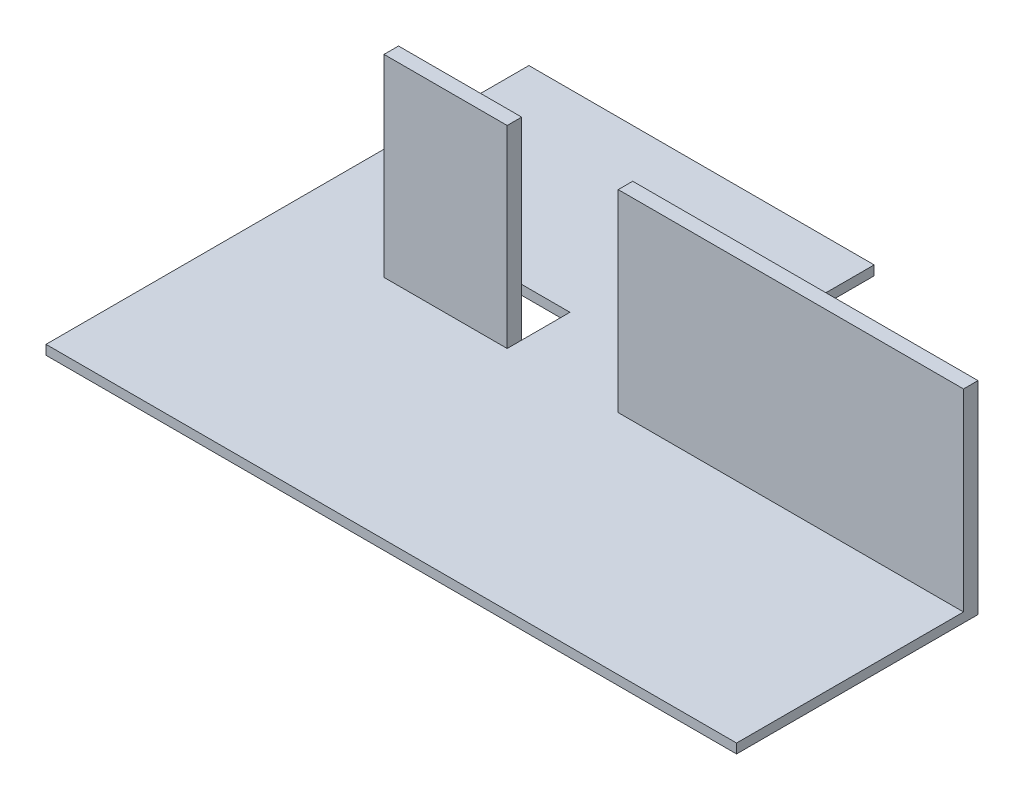
ISO-10303-21;
HEADER;
FILE_DESCRIPTION(('STEP AP214'),'2;1');
FILE_NAME('part.step','',(''),(''),'','','');
FILE_SCHEMA(('AUTOMOTIVE_DESIGN { 1 0 10303 214 1 1 1 1 }'));
ENDSEC;
DATA;
#1=APPLICATION_CONTEXT('core data for automotive mechanical design processes');
#2=APPLICATION_PROTOCOL_DEFINITION('international standard','automotive_design',2000,#1);
#3=PRODUCT_CONTEXT('',#1,'mechanical');
#4=PRODUCT('Part','Part','',(#3));
#5=PRODUCT_RELATED_PRODUCT_CATEGORY('part','',(#4));
#6=PRODUCT_DEFINITION_FORMATION('','',#4);
#7=PRODUCT_DEFINITION_CONTEXT('part definition',#1,'design');
#8=PRODUCT_DEFINITION('design','',#6,#7);
#9=PRODUCT_DEFINITION_SHAPE('','',#8);
#10=(LENGTH_UNIT() NAMED_UNIT(*) SI_UNIT(.MILLI.,.METRE.));
#11=(NAMED_UNIT(*) PLANE_ANGLE_UNIT() SI_UNIT($,.RADIAN.));
#12=(NAMED_UNIT(*) SI_UNIT($,.STERADIAN.) SOLID_ANGLE_UNIT());
#13=UNCERTAINTY_MEASURE_WITH_UNIT(LENGTH_MEASURE(1.E-05),#10,'distance_accuracy_value','');
#14=(GEOMETRIC_REPRESENTATION_CONTEXT(3) GLOBAL_UNCERTAINTY_ASSIGNED_CONTEXT((#13)) GLOBAL_UNIT_ASSIGNED_CONTEXT((#10,
#11,#12)) REPRESENTATION_CONTEXT('',''));
#15=CARTESIAN_POINT('',(0.,0.,0.));
#16=DIRECTION('',(0.,0.,1.));
#17=DIRECTION('',(1.,0.,0.));
#18=AXIS2_PLACEMENT_3D('',#15,#16,#17);
#19=CARTESIAN_POINT('',(-18.161,0.5,-12.7));
#20=DIRECTION('',(0.,-1.,0.));
#21=DIRECTION('',(0.,0.,-1.));
#22=AXIS2_PLACEMENT_3D('',#19,#20,#21);
#23=PLANE('',#22);
#24=DIRECTION('',(0.,0.,-1.));
#25=VECTOR('',#24,1.);
#26=CARTESIAN_POINT('',(-5.842,0.5,0.));
#27=LINE('',#26,#25);
#28=CARTESIAN_POINT('',(-5.842,0.5,0.762));
#29=VERTEX_POINT('',#28);
#30=CARTESIAN_POINT('',(-5.842,0.5,0.));
#31=VERTEX_POINT('',#30);
#32=EDGE_CURVE('E164',#29,#31,#27,.T.);
#33=ORIENTED_EDGE('',*,*,#32,.F.);
#34=DIRECTION('',(1.,0.,0.));
#35=VECTOR('',#34,1.);
#36=CARTESIAN_POINT('',(-5.842,0.5,0.762));
#37=LINE('',#36,#35);
#38=CARTESIAN_POINT('',(-12.319,0.5,0.762000000000001));
#39=VERTEX_POINT('',#38);
#40=EDGE_CURVE('E177',#39,#29,#37,.T.);
#41=ORIENTED_EDGE('',*,*,#40,.F.);
#42=DIRECTION('',(0.,0.,1.));
#43=VECTOR('',#42,1.);
#44=CARTESIAN_POINT('',(-12.319,0.5,0.));
#45=LINE('',#44,#43);
#46=CARTESIAN_POINT('',(-12.319,0.5,0.));
#47=VERTEX_POINT('',#46);
#48=EDGE_CURVE('E167',#47,#39,#45,.T.);
#49=ORIENTED_EDGE('',*,*,#48,.F.);
#50=DIRECTION('',(0.,0.,1.));
#51=VECTOR('',#50,1.);
#52=CARTESIAN_POINT('',(-12.319,0.5,0.));
#53=LINE('',#52,#51);
#54=CARTESIAN_POINT('',(-12.319,0.5,-2.54));
#55=VERTEX_POINT('',#54);
#56=EDGE_CURVE('E205',#55,#47,#53,.T.);
#57=ORIENTED_EDGE('',*,*,#56,.F.);
#58=DIRECTION('',(-1.,0.,0.));
#59=VECTOR('',#58,1.);
#60=CARTESIAN_POINT('',(-12.319,0.5,-2.54));
#61=LINE('',#60,#59);
#62=CARTESIAN_POINT('',(-5.842,0.5,-2.54));
#63=VERTEX_POINT('',#62);
#64=EDGE_CURVE('E202',#63,#55,#61,.T.);
#65=ORIENTED_EDGE('',*,*,#64,.F.);
#66=DIRECTION('',(0.,0.,-1.));
#67=VECTOR('',#66,1.);
#68=CARTESIAN_POINT('',(-5.842,0.5,0.));
#69=LINE('',#68,#67);
#70=EDGE_CURVE('E200',#31,#63,#69,.T.);
#71=ORIENTED_EDGE('',*,*,#70,.F.);
#72=EDGE_LOOP('',(#33,#41,#49,#57,#65,#71));
#73=FACE_BOUND('',#72,.T.);
#74=DIRECTION('',(0.,0.,1.));
#75=VECTOR('',#74,1.);
#76=CARTESIAN_POINT('',(0.,0.5,0.));
#77=LINE('',#76,#75);
#78=CARTESIAN_POINT('',(0.,0.5,0.));
#79=VERTEX_POINT('',#78);
#80=CARTESIAN_POINT('',(0.,0.5,0.762000000000007));
#81=VERTEX_POINT('',#80);
#82=EDGE_CURVE('E163',#79,#81,#77,.T.);
#83=ORIENTED_EDGE('',*,*,#82,.F.);
#84=DIRECTION('',(0.,0.,-1.));
#85=VECTOR('',#84,1.);
#86=CARTESIAN_POINT('',(0.,0.5,-12.7));
#87=LINE('',#86,#85);
#88=CARTESIAN_POINT('',(0.,0.5,-12.7));
#89=VERTEX_POINT('',#88);
#90=EDGE_CURVE('E236',#79,#89,#87,.T.);
#91=ORIENTED_EDGE('',*,*,#90,.T.);
#92=DIRECTION('',(-1.,0.,0.));
#93=VECTOR('',#92,1.);
#94=CARTESIAN_POINT('',(-18.161,0.5,-12.7));
#95=LINE('',#94,#93);
#96=CARTESIAN_POINT('',(-18.161,0.5,-12.7));
#97=VERTEX_POINT('',#96);
#98=EDGE_CURVE('E238',#89,#97,#95,.T.);
#99=ORIENTED_EDGE('',*,*,#98,.T.);
#100=DIRECTION('',(0.,0.,1.));
#101=VECTOR('',#100,1.);
#102=CARTESIAN_POINT('',(-18.161,0.5,12.7));
#103=LINE('',#102,#101);
#104=CARTESIAN_POINT('',(-18.161,0.5,12.7));
#105=VERTEX_POINT('',#104);
#106=EDGE_CURVE('E229',#97,#105,#103,.T.);
#107=ORIENTED_EDGE('',*,*,#106,.T.);
#108=DIRECTION('',(1.,0.,0.));
#109=VECTOR('',#108,1.);
#110=CARTESIAN_POINT('',(-18.161,0.5,12.7));
#111=LINE('',#110,#109);
#112=CARTESIAN_POINT('',(18.161,0.5,12.7));
#113=VERTEX_POINT('',#112);
#114=EDGE_CURVE('E232',#105,#113,#111,.T.);
#115=ORIENTED_EDGE('',*,*,#114,.T.);
#116=DIRECTION('',(0.,0.,-1.));
#117=VECTOR('',#116,1.);
#118=CARTESIAN_POINT('',(18.161,0.5,12.7));
#119=LINE('',#118,#117);
#120=CARTESIAN_POINT('',(18.161,0.5,0.762000000000007));
#121=VERTEX_POINT('',#120);
#122=EDGE_CURVE('E52',#113,#121,#119,.T.);
#123=ORIENTED_EDGE('',*,*,#122,.T.);
#124=DIRECTION('',(1.,0.,0.));
#125=VECTOR('',#124,1.);
#126=CARTESIAN_POINT('',(0.,0.5,0.762000000000007));
#127=LINE('',#126,#125);
#128=EDGE_CURVE('E47',#81,#121,#127,.T.);
#129=ORIENTED_EDGE('',*,*,#128,.F.);
#130=EDGE_LOOP('',(#83,#91,#99,#107,#115,#123,#129));
#131=FACE_BOUND('',#130,.T.);
#132=ADVANCED_FACE('F32',(#73,#131),#23,.F.);
#133=CARTESIAN_POINT('',(-18.161,0.,-12.7));
#134=DIRECTION('',(0.,-1.,0.));
#135=DIRECTION('',(0.,0.,-1.));
#136=AXIS2_PLACEMENT_3D('',#133,#134,#135);
#137=PLANE('',#136);
#138=DIRECTION('',(0.,0.,1.));
#139=VECTOR('',#138,1.);
#140=CARTESIAN_POINT('',(-18.161,0.,12.7));
#141=LINE('',#140,#139);
#142=CARTESIAN_POINT('',(-18.161,0.,-12.7));
#143=VERTEX_POINT('',#142);
#144=CARTESIAN_POINT('',(-18.161,0.,12.7));
#145=VERTEX_POINT('',#144);
#146=EDGE_CURVE('E228',#143,#145,#141,.T.);
#147=ORIENTED_EDGE('',*,*,#146,.F.);
#148=DIRECTION('',(-1.,0.,0.));
#149=VECTOR('',#148,1.);
#150=CARTESIAN_POINT('',(-18.161,0.,-12.7));
#151=LINE('',#150,#149);
#152=CARTESIAN_POINT('',(0.,0.,-12.7));
#153=VERTEX_POINT('',#152);
#154=EDGE_CURVE('E233',#153,#143,#151,.T.);
#155=ORIENTED_EDGE('',*,*,#154,.F.);
#156=DIRECTION('',(0.,0.,-1.));
#157=VECTOR('',#156,1.);
#158=CARTESIAN_POINT('',(0.,0.,-12.7));
#159=LINE('',#158,#157);
#160=CARTESIAN_POINT('',(0.,0.,0.));
#161=VERTEX_POINT('',#160);
#162=EDGE_CURVE('E249',#161,#153,#159,.T.);
#163=ORIENTED_EDGE('',*,*,#162,.F.);
#164=DIRECTION('',(-1.,0.,0.));
#165=VECTOR('',#164,1.);
#166=CARTESIAN_POINT('',(18.161,0.,0.));
#167=LINE('',#166,#165);
#168=CARTESIAN_POINT('',(18.161,0.,0.));
#169=VERTEX_POINT('',#168);
#170=EDGE_CURVE('E247',#169,#161,#167,.T.);
#171=ORIENTED_EDGE('',*,*,#170,.F.);
#172=DIRECTION('',(0.,0.,-1.));
#173=VECTOR('',#172,1.);
#174=CARTESIAN_POINT('',(18.161,0.,12.7));
#175=LINE('',#174,#173);
#176=CARTESIAN_POINT('',(18.161,0.,12.7));
#177=VERTEX_POINT('',#176);
#178=EDGE_CURVE('E245',#177,#169,#175,.T.);
#179=ORIENTED_EDGE('',*,*,#178,.F.);
#180=DIRECTION('',(1.,0.,0.));
#181=VECTOR('',#180,1.);
#182=CARTESIAN_POINT('',(-18.161,0.,12.7));
#183=LINE('',#182,#181);
#184=EDGE_CURVE('E243',#145,#177,#183,.T.);
#185=ORIENTED_EDGE('',*,*,#184,.F.);
#186=EDGE_LOOP('',(#147,#155,#163,#171,#179,#185));
#187=FACE_BOUND('',#186,.T.);
#188=DIRECTION('',(1.,0.,0.));
#189=VECTOR('',#188,1.);
#190=CARTESIAN_POINT('',(-12.319,0.,0.));
#191=LINE('',#190,#189);
#192=CARTESIAN_POINT('',(-12.319,0.,0.));
#193=VERTEX_POINT('',#192);
#194=CARTESIAN_POINT('',(-5.842,0.,0.));
#195=VERTEX_POINT('',#194);
#196=EDGE_CURVE('E203',#193,#195,#191,.T.);
#197=ORIENTED_EDGE('',*,*,#196,.T.);
#198=DIRECTION('',(0.,0.,-1.));
#199=VECTOR('',#198,1.);
#200=CARTESIAN_POINT('',(-5.842,0.,0.));
#201=LINE('',#200,#199);
#202=CARTESIAN_POINT('',(-5.842,0.,-2.54));
#203=VERTEX_POINT('',#202);
#204=EDGE_CURVE('E199',#195,#203,#201,.T.);
#205=ORIENTED_EDGE('',*,*,#204,.T.);
#206=DIRECTION('',(-1.,0.,0.));
#207=VECTOR('',#206,1.);
#208=CARTESIAN_POINT('',(-12.319,0.,-2.54));
#209=LINE('',#208,#207);
#210=CARTESIAN_POINT('',(-12.319,0.,-2.54));
#211=VERTEX_POINT('',#210);
#212=EDGE_CURVE('E211',#203,#211,#209,.T.);
#213=ORIENTED_EDGE('',*,*,#212,.T.);
#214=DIRECTION('',(0.,0.,1.));
#215=VECTOR('',#214,1.);
#216=CARTESIAN_POINT('',(-12.319,0.,0.));
#217=LINE('',#216,#215);
#218=EDGE_CURVE('E214',#211,#193,#217,.T.);
#219=ORIENTED_EDGE('',*,*,#218,.T.);
#220=EDGE_LOOP('',(#197,#205,#213,#219));
#221=FACE_BOUND('',#220,.T.);
#222=ADVANCED_FACE('F271',(#187,#221),#137,.T.);
#223=CARTESIAN_POINT('',(-18.161,0.5,12.7));
#224=DIRECTION('',(1.,0.,0.));
#225=DIRECTION('',(0.,0.,-1.));
#226=AXIS2_PLACEMENT_3D('',#223,#224,#225);
#227=PLANE('',#226);
#228=ORIENTED_EDGE('',*,*,#146,.T.);
#229=DIRECTION('',(0.,-1.,0.));
#230=VECTOR('',#229,1.);
#231=CARTESIAN_POINT('',(-18.161,0.5,12.7));
#232=LINE('',#231,#230);
#233=EDGE_CURVE('E11',#105,#145,#232,.T.);
#234=ORIENTED_EDGE('',*,*,#233,.F.);
#235=ORIENTED_EDGE('',*,*,#106,.F.);
#236=DIRECTION('',(0.,-1.,0.));
#237=VECTOR('',#236,1.);
#238=CARTESIAN_POINT('',(-18.161,0.5,-12.7));
#239=LINE('',#238,#237);
#240=EDGE_CURVE('E240',#97,#143,#239,.T.);
#241=ORIENTED_EDGE('',*,*,#240,.T.);
#242=EDGE_LOOP('',(#228,#234,#235,#241));
#243=FACE_BOUND('',#242,.T.);
#244=ADVANCED_FACE('F34',(#243),#227,.F.);
#245=CARTESIAN_POINT('',(-18.161,0.5,12.7));
#246=DIRECTION('',(0.,0.,-1.));
#247=DIRECTION('',(-1.,0.,0.));
#248=AXIS2_PLACEMENT_3D('',#245,#246,#247);
#249=PLANE('',#248);
#250=ORIENTED_EDGE('',*,*,#184,.T.);
#251=DIRECTION('',(0.,-1.,0.));
#252=VECTOR('',#251,1.);
#253=CARTESIAN_POINT('',(18.161,0.5,12.7));
#254=LINE('',#253,#252);
#255=EDGE_CURVE('E40',#113,#177,#254,.T.);
#256=ORIENTED_EDGE('',*,*,#255,.F.);
#257=ORIENTED_EDGE('',*,*,#114,.F.);
#258=ORIENTED_EDGE('',*,*,#233,.T.);
#259=EDGE_LOOP('',(#250,#256,#257,#258));
#260=FACE_BOUND('',#259,.T.);
#261=ADVANCED_FACE('F292',(#260),#249,.F.);
#262=CARTESIAN_POINT('',(18.161,0.5,12.7));
#263=DIRECTION('',(-1.,0.,0.));
#264=DIRECTION('',(0.,0.,1.));
#265=AXIS2_PLACEMENT_3D('',#262,#263,#264);
#266=PLANE('',#265);
#267=ORIENTED_EDGE('',*,*,#178,.T.);
#268=DIRECTION('',(0.,-1.,0.));
#269=VECTOR('',#268,1.);
#270=CARTESIAN_POINT('',(18.161,0.5,0.));
#271=LINE('',#270,#269);
#272=CARTESIAN_POINT('',(18.161,10.66,0.));
#273=VERTEX_POINT('',#272);
#274=EDGE_CURVE('E260',#273,#169,#271,.T.);
#275=ORIENTED_EDGE('',*,*,#274,.F.);
#276=DIRECTION('',(0.,0.,-1.));
#277=VECTOR('',#276,1.);
#278=CARTESIAN_POINT('',(18.161,10.66,0.));
#279=LINE('',#278,#277);
#280=CARTESIAN_POINT('',(18.161,10.66,0.762000000000007));
#281=VERTEX_POINT('',#280);
#282=EDGE_CURVE('E151',#281,#273,#279,.T.);
#283=ORIENTED_EDGE('',*,*,#282,.F.);
#284=DIRECTION('',(0.,-1.,0.));
#285=VECTOR('',#284,1.);
#286=CARTESIAN_POINT('',(18.161,10.66,0.762000000000007));
#287=LINE('',#286,#285);
#288=EDGE_CURVE('E147',#281,#121,#287,.T.);
#289=ORIENTED_EDGE('',*,*,#288,.T.);
#290=ORIENTED_EDGE('',*,*,#122,.F.);
#291=ORIENTED_EDGE('',*,*,#255,.T.);
#292=EDGE_LOOP('',(#267,#275,#283,#289,#290,#291));
#293=FACE_BOUND('',#292,.T.);
#294=ADVANCED_FACE('F266',(#293),#266,.F.);
#295=CARTESIAN_POINT('',(18.161,0.5,0.));
#296=DIRECTION('',(0.,0.,1.));
#297=DIRECTION('',(1.,0.,0.));
#298=AXIS2_PLACEMENT_3D('',#295,#296,#297);
#299=PLANE('',#298);
#300=ORIENTED_EDGE('',*,*,#170,.T.);
#301=DIRECTION('',(0.,-1.,0.));
#302=VECTOR('',#301,1.);
#303=CARTESIAN_POINT('',(0.,0.5,0.));
#304=LINE('',#303,#302);
#305=EDGE_CURVE('E257',#79,#161,#304,.T.);
#306=ORIENTED_EDGE('',*,*,#305,.F.);
#307=DIRECTION('',(0.,-1.,0.));
#308=VECTOR('',#307,1.);
#309=CARTESIAN_POINT('',(0.,10.66,0.));
#310=LINE('',#309,#308);
#311=CARTESIAN_POINT('',(0.,10.66,0.));
#312=VERTEX_POINT('',#311);
#313=EDGE_CURVE('E169',#312,#79,#310,.T.);
#314=ORIENTED_EDGE('',*,*,#313,.F.);
#315=DIRECTION('',(-1.,0.,0.));
#316=VECTOR('',#315,1.);
#317=CARTESIAN_POINT('',(0.,10.66,0.));
#318=LINE('',#317,#316);
#319=EDGE_CURVE('E157',#273,#312,#318,.T.);
#320=ORIENTED_EDGE('',*,*,#319,.F.);
#321=ORIENTED_EDGE('',*,*,#274,.T.);
#322=EDGE_LOOP('',(#300,#306,#314,#320,#321));
#323=FACE_BOUND('',#322,.T.);
#324=ADVANCED_FACE('F277',(#323),#299,.F.);
#325=CARTESIAN_POINT('',(0.,0.5,-12.7));
#326=DIRECTION('',(-1.,0.,0.));
#327=DIRECTION('',(0.,0.,1.));
#328=AXIS2_PLACEMENT_3D('',#325,#326,#327);
#329=PLANE('',#328);
#330=ORIENTED_EDGE('',*,*,#162,.T.);
#331=DIRECTION('',(0.,-1.,0.));
#332=VECTOR('',#331,1.);
#333=CARTESIAN_POINT('',(0.,0.5,-12.7));
#334=LINE('',#333,#332);
#335=EDGE_CURVE('E254',#89,#153,#334,.T.);
#336=ORIENTED_EDGE('',*,*,#335,.F.);
#337=ORIENTED_EDGE('',*,*,#90,.F.);
#338=ORIENTED_EDGE('',*,*,#305,.T.);
#339=EDGE_LOOP('',(#330,#336,#337,#338));
#340=FACE_BOUND('',#339,.T.);
#341=ADVANCED_FACE('F279',(#340),#329,.F.);
#342=CARTESIAN_POINT('',(-18.161,0.5,-12.7));
#343=DIRECTION('',(0.,0.,1.));
#344=DIRECTION('',(1.,0.,0.));
#345=AXIS2_PLACEMENT_3D('',#342,#343,#344);
#346=PLANE('',#345);
#347=ORIENTED_EDGE('',*,*,#154,.T.);
#348=ORIENTED_EDGE('',*,*,#240,.F.);
#349=ORIENTED_EDGE('',*,*,#98,.F.);
#350=ORIENTED_EDGE('',*,*,#335,.T.);
#351=EDGE_LOOP('',(#347,#348,#349,#350));
#352=FACE_BOUND('',#351,.T.);
#353=ADVANCED_FACE('F290',(#352),#346,.F.);
#354=CARTESIAN_POINT('',(-5.842,0.5,0.));
#355=DIRECTION('',(-1.,0.,0.));
#356=DIRECTION('',(0.,0.,1.));
#357=AXIS2_PLACEMENT_3D('',#354,#355,#356);
#358=PLANE('',#357);
#359=ORIENTED_EDGE('',*,*,#204,.F.);
#360=DIRECTION('',(0.,-1.,0.));
#361=VECTOR('',#360,1.);
#362=CARTESIAN_POINT('',(-5.842,0.5,0.));
#363=LINE('',#362,#361);
#364=EDGE_CURVE('E208',#31,#195,#363,.T.);
#365=ORIENTED_EDGE('',*,*,#364,.F.);
#366=ORIENTED_EDGE('',*,*,#70,.T.);
#367=DIRECTION('',(0.,-1.,0.));
#368=VECTOR('',#367,1.);
#369=CARTESIAN_POINT('',(-5.842,0.5,-2.54));
#370=LINE('',#369,#368);
#371=EDGE_CURVE('E225',#63,#203,#370,.T.);
#372=ORIENTED_EDGE('',*,*,#371,.T.);
#373=EDGE_LOOP('',(#359,#365,#366,#372));
#374=FACE_BOUND('',#373,.T.);
#375=ADVANCED_FACE('F307',(#374),#358,.T.);
#376=CARTESIAN_POINT('',(-12.319,0.5,-2.54));
#377=DIRECTION('',(0.,0.,1.));
#378=DIRECTION('',(1.,0.,0.));
#379=AXIS2_PLACEMENT_3D('',#376,#377,#378);
#380=PLANE('',#379);
#381=ORIENTED_EDGE('',*,*,#212,.F.);
#382=ORIENTED_EDGE('',*,*,#371,.F.);
#383=ORIENTED_EDGE('',*,*,#64,.T.);
#384=DIRECTION('',(0.,-1.,0.));
#385=VECTOR('',#384,1.);
#386=CARTESIAN_POINT('',(-12.319,0.5,-2.54));
#387=LINE('',#386,#385);
#388=EDGE_CURVE('E223',#55,#211,#387,.T.);
#389=ORIENTED_EDGE('',*,*,#388,.T.);
#390=EDGE_LOOP('',(#381,#382,#383,#389));
#391=FACE_BOUND('',#390,.T.);
#392=ADVANCED_FACE('F334',(#391),#380,.T.);
#393=CARTESIAN_POINT('',(-12.319,0.5,0.));
#394=DIRECTION('',(1.,0.,0.));
#395=DIRECTION('',(0.,0.,-1.));
#396=AXIS2_PLACEMENT_3D('',#393,#394,#395);
#397=PLANE('',#396);
#398=ORIENTED_EDGE('',*,*,#218,.F.);
#399=ORIENTED_EDGE('',*,*,#388,.F.);
#400=ORIENTED_EDGE('',*,*,#56,.T.);
#401=DIRECTION('',(0.,-1.,0.));
#402=VECTOR('',#401,1.);
#403=CARTESIAN_POINT('',(-12.319,0.5,0.));
#404=LINE('',#403,#402);
#405=EDGE_CURVE('E221',#47,#193,#404,.T.);
#406=ORIENTED_EDGE('',*,*,#405,.T.);
#407=EDGE_LOOP('',(#398,#399,#400,#406));
#408=FACE_BOUND('',#407,.T.);
#409=ADVANCED_FACE('F341',(#408),#397,.T.);
#410=CARTESIAN_POINT('',(-12.319,0.5,0.));
#411=DIRECTION('',(0.,0.,-1.));
#412=DIRECTION('',(-1.,0.,0.));
#413=AXIS2_PLACEMENT_3D('',#410,#411,#412);
#414=PLANE('',#413);
#415=ORIENTED_EDGE('',*,*,#196,.F.);
#416=ORIENTED_EDGE('',*,*,#405,.F.);
#417=DIRECTION('',(0.,-1.,0.));
#418=VECTOR('',#417,1.);
#419=CARTESIAN_POINT('',(-12.319,10.66,0.));
#420=LINE('',#419,#418);
#421=CARTESIAN_POINT('',(-12.319,10.66,0.));
#422=VERTEX_POINT('',#421);
#423=EDGE_CURVE('E193',#422,#47,#420,.T.);
#424=ORIENTED_EDGE('',*,*,#423,.F.);
#425=DIRECTION('',(-1.,0.,0.));
#426=VECTOR('',#425,1.);
#427=CARTESIAN_POINT('',(-5.842,10.66,0.));
#428=LINE('',#427,#426);
#429=CARTESIAN_POINT('',(-5.842,10.66,0.));
#430=VERTEX_POINT('',#429);
#431=EDGE_CURVE('E176',#430,#422,#428,.T.);
#432=ORIENTED_EDGE('',*,*,#431,.F.);
#433=DIRECTION('',(0.,-1.,0.));
#434=VECTOR('',#433,1.);
#435=CARTESIAN_POINT('',(-5.842,10.66,0.));
#436=LINE('',#435,#434);
#437=EDGE_CURVE('E196',#430,#31,#436,.T.);
#438=ORIENTED_EDGE('',*,*,#437,.T.);
#439=ORIENTED_EDGE('',*,*,#364,.T.);
#440=EDGE_LOOP('',(#415,#416,#424,#432,#438,#439));
#441=FACE_BOUND('',#440,.T.);
#442=ADVANCED_FACE('F347',(#441),#414,.T.);
#443=CARTESIAN_POINT('',(-5.842,10.66,0.));
#444=DIRECTION('',(-1.,0.,0.));
#445=DIRECTION('',(0.,0.,1.));
#446=AXIS2_PLACEMENT_3D('',#443,#444,#445);
#447=PLANE('',#446);
#448=ORIENTED_EDGE('',*,*,#32,.T.);
#449=ORIENTED_EDGE('',*,*,#437,.F.);
#450=DIRECTION('',(0.,0.,-1.));
#451=VECTOR('',#450,1.);
#452=CARTESIAN_POINT('',(-5.842,10.66,0.));
#453=LINE('',#452,#451);
#454=CARTESIAN_POINT('',(-5.842,10.66,0.762));
#455=VERTEX_POINT('',#454);
#456=EDGE_CURVE('E173',#455,#430,#453,.T.);
#457=ORIENTED_EDGE('',*,*,#456,.F.);
#458=DIRECTION('',(0.,-1.,0.));
#459=VECTOR('',#458,1.);
#460=CARTESIAN_POINT('',(-5.842,10.66,0.762));
#461=LINE('',#460,#459);
#462=EDGE_CURVE('E182',#455,#29,#461,.T.);
#463=ORIENTED_EDGE('',*,*,#462,.T.);
#464=EDGE_LOOP('',(#448,#449,#457,#463));
#465=FACE_BOUND('',#464,.T.);
#466=ADVANCED_FACE('F355',(#465),#447,.F.);
#467=CARTESIAN_POINT('',(-12.319,10.66,0.));
#468=DIRECTION('',(1.,0.,0.));
#469=DIRECTION('',(0.,0.,-1.));
#470=AXIS2_PLACEMENT_3D('',#467,#468,#469);
#471=PLANE('',#470);
#472=ORIENTED_EDGE('',*,*,#48,.T.);
#473=DIRECTION('',(0.,-1.,0.));
#474=VECTOR('',#473,1.);
#475=CARTESIAN_POINT('',(-12.319,10.66,0.762000000000001));
#476=LINE('',#475,#474);
#477=CARTESIAN_POINT('',(-12.319,10.66,0.762000000000001));
#478=VERTEX_POINT('',#477);
#479=EDGE_CURVE('E190',#478,#39,#476,.T.);
#480=ORIENTED_EDGE('',*,*,#479,.F.);
#481=DIRECTION('',(0.,0.,1.));
#482=VECTOR('',#481,1.);
#483=CARTESIAN_POINT('',(-12.319,10.66,0.));
#484=LINE('',#483,#482);
#485=EDGE_CURVE('E179',#422,#478,#484,.T.);
#486=ORIENTED_EDGE('',*,*,#485,.F.);
#487=ORIENTED_EDGE('',*,*,#423,.T.);
#488=EDGE_LOOP('',(#472,#480,#486,#487));
#489=FACE_BOUND('',#488,.T.);
#490=ADVANCED_FACE('F363',(#489),#471,.F.);
#491=CARTESIAN_POINT('',(-5.842,10.66,0.762));
#492=DIRECTION('',(0.,0.,-1.));
#493=DIRECTION('',(-1.,0.,0.));
#494=AXIS2_PLACEMENT_3D('',#491,#492,#493);
#495=PLANE('',#494);
#496=ORIENTED_EDGE('',*,*,#40,.T.);
#497=ORIENTED_EDGE('',*,*,#462,.F.);
#498=DIRECTION('',(1.,0.,0.));
#499=VECTOR('',#498,1.);
#500=CARTESIAN_POINT('',(-5.842,10.66,0.762));
#501=LINE('',#500,#499);
#502=EDGE_CURVE('E181',#478,#455,#501,.T.);
#503=ORIENTED_EDGE('',*,*,#502,.F.);
#504=ORIENTED_EDGE('',*,*,#479,.T.);
#505=EDGE_LOOP('',(#496,#497,#503,#504));
#506=FACE_BOUND('',#505,.T.);
#507=ADVANCED_FACE('F371',(#506),#495,.F.);
#508=CARTESIAN_POINT('',(-5.842,10.66,0.762));
#509=DIRECTION('',(0.,-1.,0.));
#510=DIRECTION('',(0.,0.,-1.));
#511=AXIS2_PLACEMENT_3D('',#508,#509,#510);
#512=PLANE('',#511);
#513=ORIENTED_EDGE('',*,*,#456,.T.);
#514=ORIENTED_EDGE('',*,*,#431,.T.);
#515=ORIENTED_EDGE('',*,*,#485,.T.);
#516=ORIENTED_EDGE('',*,*,#502,.T.);
#517=EDGE_LOOP('',(#513,#514,#515,#516));
#518=FACE_BOUND('',#517,.T.);
#519=ADVANCED_FACE('F379',(#518),#512,.F.);
#520=CARTESIAN_POINT('',(0.,10.66,0.));
#521=DIRECTION('',(1.,0.,0.));
#522=DIRECTION('',(0.,0.,-1.));
#523=AXIS2_PLACEMENT_3D('',#520,#521,#522);
#524=PLANE('',#523);
#525=ORIENTED_EDGE('',*,*,#82,.T.);
#526=DIRECTION('',(0.,-1.,0.));
#527=VECTOR('',#526,1.);
#528=CARTESIAN_POINT('',(0.,10.66,0.762000000000007));
#529=LINE('',#528,#527);
#530=CARTESIAN_POINT('',(0.,10.66,0.762000000000007));
#531=VERTEX_POINT('',#530);
#532=EDGE_CURVE('E144',#531,#81,#529,.T.);
#533=ORIENTED_EDGE('',*,*,#532,.F.);
#534=DIRECTION('',(0.,0.,1.));
#535=VECTOR('',#534,1.);
#536=CARTESIAN_POINT('',(0.,10.66,0.));
#537=LINE('',#536,#535);
#538=EDGE_CURVE('E152',#312,#531,#537,.T.);
#539=ORIENTED_EDGE('',*,*,#538,.F.);
#540=ORIENTED_EDGE('',*,*,#313,.T.);
#541=EDGE_LOOP('',(#525,#533,#539,#540));
#542=FACE_BOUND('',#541,.T.);
#543=ADVANCED_FACE('F162',(#542),#524,.F.);
#544=CARTESIAN_POINT('',(0.,10.66,0.762000000000007));
#545=DIRECTION('',(0.,0.,-1.));
#546=DIRECTION('',(-1.,0.,0.));
#547=AXIS2_PLACEMENT_3D('',#544,#545,#546);
#548=PLANE('',#547);
#549=ORIENTED_EDGE('',*,*,#128,.T.);
#550=ORIENTED_EDGE('',*,*,#288,.F.);
#551=DIRECTION('',(1.,0.,0.));
#552=VECTOR('',#551,1.);
#553=CARTESIAN_POINT('',(0.,10.66,0.762000000000007));
#554=LINE('',#553,#552);
#555=EDGE_CURVE('E140',#531,#281,#554,.T.);
#556=ORIENTED_EDGE('',*,*,#555,.F.);
#557=ORIENTED_EDGE('',*,*,#532,.T.);
#558=EDGE_LOOP('',(#549,#550,#556,#557));
#559=FACE_BOUND('',#558,.T.);
#560=ADVANCED_FACE('F142',(#559),#548,.F.);
#561=CARTESIAN_POINT('',(0.,10.66,0.762000000000007));
#562=DIRECTION('',(0.,1.,0.));
#563=DIRECTION('',(0.,0.,1.));
#564=AXIS2_PLACEMENT_3D('',#561,#562,#563);
#565=PLANE('',#564);
#566=ORIENTED_EDGE('',*,*,#538,.T.);
#567=ORIENTED_EDGE('',*,*,#555,.T.);
#568=ORIENTED_EDGE('',*,*,#282,.T.);
#569=ORIENTED_EDGE('',*,*,#319,.T.);
#570=EDGE_LOOP('',(#566,#567,#568,#569));
#571=FACE_BOUND('',#570,.T.);
#572=ADVANCED_FACE('F155',(#571),#565,.T.);
#573=CLOSED_SHELL('',(#132,#222,#244,#261,#294,#324,#341,#353,#375,#392,#409,#442,#466,#490,
#507,#519,#543,#560,#572));
#574=MANIFOLD_SOLID_BREP('B2',#573);
#575=ADVANCED_BREP_SHAPE_REPRESENTATION('',(#18,#574),#14);
#576=SHAPE_DEFINITION_REPRESENTATION(#9,#575);
ENDSEC;
END-ISO-10303-21;
